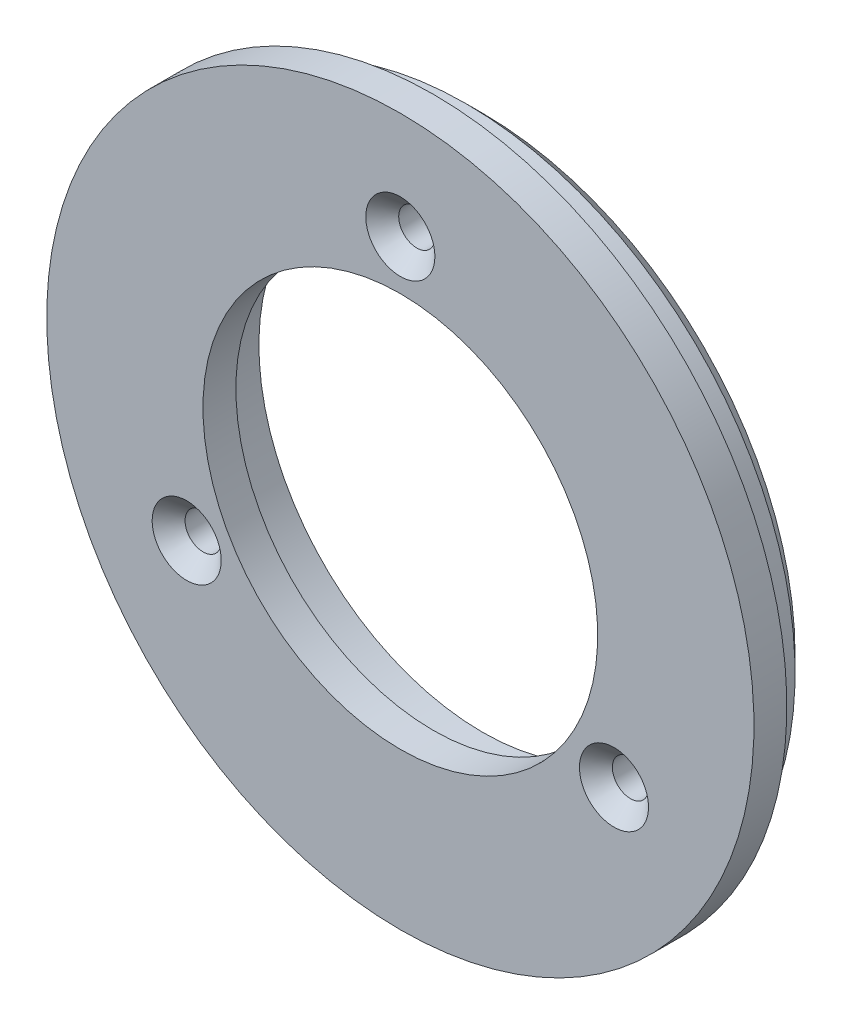
ISO-10303-21;
HEADER;
FILE_DESCRIPTION(('STEP AP214'),'2;1');
FILE_NAME('part.step','',(''),(''),'','','');
FILE_SCHEMA(('AUTOMOTIVE_DESIGN { 1 0 10303 214 1 1 1 1 }'));
ENDSEC;
DATA;
#1=APPLICATION_CONTEXT('core data for automotive mechanical design processes');
#2=APPLICATION_PROTOCOL_DEFINITION('international standard','automotive_design',2000,#1);
#3=PRODUCT_CONTEXT('',#1,'mechanical');
#4=PRODUCT('Part','Part','',(#3));
#5=PRODUCT_RELATED_PRODUCT_CATEGORY('part','',(#4));
#6=PRODUCT_DEFINITION_FORMATION('','',#4);
#7=PRODUCT_DEFINITION_CONTEXT('part definition',#1,'design');
#8=PRODUCT_DEFINITION('design','',#6,#7);
#9=PRODUCT_DEFINITION_SHAPE('','',#8);
#10=(LENGTH_UNIT() NAMED_UNIT(*) SI_UNIT(.MILLI.,.METRE.));
#11=(NAMED_UNIT(*) PLANE_ANGLE_UNIT() SI_UNIT($,.RADIAN.));
#12=(NAMED_UNIT(*) SI_UNIT($,.STERADIAN.) SOLID_ANGLE_UNIT());
#13=UNCERTAINTY_MEASURE_WITH_UNIT(LENGTH_MEASURE(1.E-05),#10,'distance_accuracy_value','');
#14=(GEOMETRIC_REPRESENTATION_CONTEXT(3) GLOBAL_UNCERTAINTY_ASSIGNED_CONTEXT((#13)) GLOBAL_UNIT_ASSIGNED_CONTEXT((#10,
#11,#12)) REPRESENTATION_CONTEXT('',''));
#15=CARTESIAN_POINT('',(0.,0.,0.));
#16=DIRECTION('',(0.,0.,1.));
#17=DIRECTION('',(1.,0.,0.));
#18=AXIS2_PLACEMENT_3D('',#15,#16,#17);
#19=CARTESIAN_POINT('',(0.,12.,0.));
#20=DIRECTION('',(0.,0.,-1.));
#21=DIRECTION('',(0.,1.,0.));
#22=AXIS2_PLACEMENT_3D('',#19,#20,#21);
#23=PLANE('',#22);
#24=CARTESIAN_POINT('',(-12.9903810567672,-7.49999999999963,0.));
#25=DIRECTION('',(0.,0.,-1.));
#26=DIRECTION('',(0.,1.,0.));
#27=AXIS2_PLACEMENT_3D('',#24,#25,#26);
#28=CIRCLE('',#27,2.10000000000057);
#29=CARTESIAN_POINT('',(-12.9903810567672,-5.39999999999906,0.));
#30=VERTEX_POINT('',#29);
#31=EDGE_CURVE('E64',#30,#30,#28,.T.);
#32=ORIENTED_EDGE('',*,*,#31,.T.);
#33=EDGE_LOOP('',(#32));
#34=FACE_BOUND('',#33,.T.);
#35=CARTESIAN_POINT('',(12.9903810567659,-7.50000000000036,0.));
#36=DIRECTION('',(0.,0.,-1.));
#37=DIRECTION('',(0.,1.,0.));
#38=AXIS2_PLACEMENT_3D('',#35,#36,#37);
#39=CIRCLE('',#38,2.10000000000084);
#40=CARTESIAN_POINT('',(12.9903810567659,-5.39999999999953,0.));
#41=VERTEX_POINT('',#40);
#42=EDGE_CURVE('E70',#41,#41,#39,.T.);
#43=ORIENTED_EDGE('',*,*,#42,.T.);
#44=EDGE_LOOP('',(#43));
#45=FACE_BOUND('',#44,.T.);
#46=CARTESIAN_POINT('',(0.,15.,0.));
#47=DIRECTION('',(0.,0.,-1.));
#48=DIRECTION('',(0.,1.,0.));
#49=AXIS2_PLACEMENT_3D('',#46,#47,#48);
#50=CIRCLE('',#49,2.1);
#51=CARTESIAN_POINT('',(0.,17.1,0.));
#52=VERTEX_POINT('',#51);
#53=EDGE_CURVE('E74',#52,#52,#50,.T.);
#54=ORIENTED_EDGE('',*,*,#53,.T.);
#55=EDGE_LOOP('',(#54));
#56=FACE_BOUND('',#55,.T.);
#57=CARTESIAN_POINT('',(0.,0.,0.));
#58=DIRECTION('',(0.,0.,1.));
#59=DIRECTION('',(0.,-1.,0.));
#60=AXIS2_PLACEMENT_3D('',#57,#58,#59);
#61=CIRCLE('',#60,12.);
#62=CARTESIAN_POINT('',(0.,-12.,0.));
#63=VERTEX_POINT('',#62);
#64=EDGE_CURVE('E110',#63,#63,#61,.T.);
#65=ORIENTED_EDGE('',*,*,#64,.F.);
#66=EDGE_LOOP('',(#65));
#67=FACE_BOUND('',#66,.T.);
#68=CARTESIAN_POINT('',(0.,0.,0.));
#69=DIRECTION('',(0.,0.,1.));
#70=DIRECTION('',(0.,-1.,0.));
#71=AXIS2_PLACEMENT_3D('',#68,#69,#70);
#72=CIRCLE('',#71,21.5);
#73=CARTESIAN_POINT('',(0.,-21.5,0.));
#74=VERTEX_POINT('',#73);
#75=EDGE_CURVE('E86',#74,#74,#72,.T.);
#76=ORIENTED_EDGE('',*,*,#75,.T.);
#77=EDGE_LOOP('',(#76));
#78=FACE_BOUND('',#77,.T.);
#79=ADVANCED_FACE('F45',(#34,#45,#56,#67,#78),#23,.F.);
#80=CARTESIAN_POINT('',(0.,0.,0.));
#81=DIRECTION('',(0.,0.,1.));
#82=DIRECTION('',(0.,-1.,0.));
#83=AXIS2_PLACEMENT_3D('',#80,#81,#82);
#84=CYLINDRICAL_SURFACE('',#83,21.5);
#85=ORIENTED_EDGE('',*,*,#75,.F.);
#86=EDGE_LOOP('',(#85));
#87=FACE_BOUND('',#86,.T.);
#88=CARTESIAN_POINT('',(0.,0.,-2.));
#89=DIRECTION('',(0.,0.,1.));
#90=DIRECTION('',(0.,-1.,0.));
#91=AXIS2_PLACEMENT_3D('',#88,#89,#90);
#92=CIRCLE('',#91,21.5);
#93=CARTESIAN_POINT('',(0.,-21.5,-2.));
#94=VERTEX_POINT('',#93);
#95=EDGE_CURVE('E90',#94,#94,#92,.T.);
#96=ORIENTED_EDGE('',*,*,#95,.T.);
#97=EDGE_LOOP('',(#96));
#98=FACE_BOUND('',#97,.T.);
#99=ADVANCED_FACE('F163',(#87,#98),#84,.T.);
#100=CARTESIAN_POINT('',(0.,21.5,-2.));
#101=DIRECTION('',(0.,0.,1.));
#102=DIRECTION('',(0.,-1.,0.));
#103=AXIS2_PLACEMENT_3D('',#100,#101,#102);
#104=PLANE('',#103);
#105=ORIENTED_EDGE('',*,*,#95,.F.);
#106=EDGE_LOOP('',(#105));
#107=FACE_BOUND('',#106,.T.);
#108=CARTESIAN_POINT('',(0.,0.,-2.));
#109=DIRECTION('',(0.,0.,1.));
#110=DIRECTION('',(0.,-1.,0.));
#111=AXIS2_PLACEMENT_3D('',#108,#109,#110);
#112=CIRCLE('',#111,20.);
#113=CARTESIAN_POINT('',(0.,-20.,-2.));
#114=VERTEX_POINT('',#113);
#115=EDGE_CURVE('E94',#114,#114,#112,.T.);
#116=ORIENTED_EDGE('',*,*,#115,.T.);
#117=EDGE_LOOP('',(#116));
#118=FACE_BOUND('',#117,.T.);
#119=ADVANCED_FACE('F170',(#107,#118),#104,.F.);
#120=CARTESIAN_POINT('',(0.,0.,0.));
#121=DIRECTION('',(0.,0.,1.));
#122=DIRECTION('',(0.,-1.,0.));
#123=AXIS2_PLACEMENT_3D('',#120,#121,#122);
#124=CYLINDRICAL_SURFACE('',#123,20.);
#125=CARTESIAN_POINT('',(0.,0.,-3.99999999999999));
#126=DIRECTION('',(0.,0.,1.));
#127=DIRECTION('',(0.,-1.,0.));
#128=AXIS2_PLACEMENT_3D('',#125,#126,#127);
#129=CIRCLE('',#128,20.);
#130=CARTESIAN_POINT('',(0.,-20.,-3.99999999999999));
#131=VERTEX_POINT('',#130);
#132=EDGE_CURVE('E82',#131,#131,#129,.T.);
#133=ORIENTED_EDGE('',*,*,#132,.T.);
#134=EDGE_LOOP('',(#133));
#135=FACE_BOUND('',#134,.T.);
#136=ORIENTED_EDGE('',*,*,#115,.F.);
#137=EDGE_LOOP('',(#136));
#138=FACE_BOUND('',#137,.T.);
#139=ADVANCED_FACE('F133',(#135,#138),#124,.T.);
#140=CARTESIAN_POINT('',(0.,20.,-5.));
#141=DIRECTION('',(0.,0.,1.));
#142=DIRECTION('',(0.,-1.,0.));
#143=AXIS2_PLACEMENT_3D('',#140,#141,#142);
#144=PLANE('',#143);
#145=CARTESIAN_POINT('',(-12.9903810567672,-7.49999999999963,-5.));
#146=DIRECTION('',(0.,0.,-1.));
#147=DIRECTION('',(-1.,0.,0.));
#148=AXIS2_PLACEMENT_3D('',#145,#146,#147);
#149=CIRCLE('',#148,1.10000000000057);
#150=CARTESIAN_POINT('',(-14.0903810567678,-7.49999999999963,-5.));
#151=VERTEX_POINT('',#150);
#152=EDGE_CURVE('E114',#151,#151,#149,.T.);
#153=ORIENTED_EDGE('',*,*,#152,.F.);
#154=EDGE_LOOP('',(#153));
#155=FACE_BOUND('',#154,.T.);
#156=CARTESIAN_POINT('',(12.9903810567659,-7.50000000000036,-5.));
#157=DIRECTION('',(0.,0.,-1.));
#158=DIRECTION('',(-1.,0.,0.));
#159=AXIS2_PLACEMENT_3D('',#156,#157,#158);
#160=CIRCLE('',#159,1.10000000000084);
#161=CARTESIAN_POINT('',(11.8903810567651,-7.50000000000036,-5.));
#162=VERTEX_POINT('',#161);
#163=EDGE_CURVE('E119',#162,#162,#160,.T.);
#164=ORIENTED_EDGE('',*,*,#163,.F.);
#165=EDGE_LOOP('',(#164));
#166=FACE_BOUND('',#165,.T.);
#167=CARTESIAN_POINT('',(0.,15.,-5.));
#168=DIRECTION('',(0.,0.,-1.));
#169=DIRECTION('',(0.,1.,0.));
#170=AXIS2_PLACEMENT_3D('',#167,#168,#169);
#171=CIRCLE('',#170,1.1);
#172=CARTESIAN_POINT('',(0.,16.1,-5.));
#173=VERTEX_POINT('',#172);
#174=EDGE_CURVE('E115',#173,#173,#171,.T.);
#175=ORIENTED_EDGE('',*,*,#174,.F.);
#176=EDGE_LOOP('',(#175));
#177=FACE_BOUND('',#176,.T.);
#178=CARTESIAN_POINT('',(0.,0.,-5.));
#179=DIRECTION('',(0.,0.,1.));
#180=DIRECTION('',(0.,-1.,0.));
#181=AXIS2_PLACEMENT_3D('',#178,#179,#180);
#182=CIRCLE('',#181,19.);
#183=CARTESIAN_POINT('',(0.,-19.,-5.));
#184=VERTEX_POINT('',#183);
#185=EDGE_CURVE('E78',#184,#184,#182,.F.);
#186=ORIENTED_EDGE('',*,*,#185,.T.);
#187=EDGE_LOOP('',(#186));
#188=FACE_BOUND('',#187,.T.);
#189=CARTESIAN_POINT('',(0.,0.,-5.));
#190=DIRECTION('',(0.,0.,1.));
#191=DIRECTION('',(0.,-1.,0.));
#192=AXIS2_PLACEMENT_3D('',#189,#190,#191);
#193=CIRCLE('',#192,13.6);
#194=CARTESIAN_POINT('',(0.,-13.6,-5.));
#195=VERTEX_POINT('',#194);
#196=EDGE_CURVE('E98',#195,#195,#193,.T.);
#197=ORIENTED_EDGE('',*,*,#196,.T.);
#198=EDGE_LOOP('',(#197));
#199=FACE_BOUND('',#198,.T.);
#200=ADVANCED_FACE('F129',(#155,#166,#177,#188,#199),#144,.F.);
#201=CARTESIAN_POINT('',(0.,0.,0.));
#202=DIRECTION('',(0.,0.,1.));
#203=DIRECTION('',(0.,-1.,0.));
#204=AXIS2_PLACEMENT_3D('',#201,#202,#203);
#205=CYLINDRICAL_SURFACE('',#204,13.6);
#206=ORIENTED_EDGE('',*,*,#196,.F.);
#207=EDGE_LOOP('',(#206));
#208=FACE_BOUND('',#207,.T.);
#209=CARTESIAN_POINT('',(0.,0.,-2.));
#210=DIRECTION('',(0.,0.,1.));
#211=DIRECTION('',(0.,-1.,0.));
#212=AXIS2_PLACEMENT_3D('',#209,#210,#211);
#213=CIRCLE('',#212,13.6);
#214=CARTESIAN_POINT('',(0.,-13.6,-2.));
#215=VERTEX_POINT('',#214);
#216=EDGE_CURVE('E102',#215,#215,#213,.T.);
#217=ORIENTED_EDGE('',*,*,#216,.T.);
#218=EDGE_LOOP('',(#217));
#219=FACE_BOUND('',#218,.T.);
#220=ADVANCED_FACE('F132',(#208,#219),#205,.F.);
#221=CARTESIAN_POINT('',(0.,12.,-2.));
#222=DIRECTION('',(0.,0.,1.));
#223=DIRECTION('',(0.,-1.,0.));
#224=AXIS2_PLACEMENT_3D('',#221,#222,#223);
#225=PLANE('',#224);
#226=ORIENTED_EDGE('',*,*,#216,.F.);
#227=EDGE_LOOP('',(#226));
#228=FACE_BOUND('',#227,.T.);
#229=CARTESIAN_POINT('',(0.,0.,-2.));
#230=DIRECTION('',(0.,0.,1.));
#231=DIRECTION('',(0.,-1.,0.));
#232=AXIS2_PLACEMENT_3D('',#229,#230,#231);
#233=CIRCLE('',#232,12.);
#234=CARTESIAN_POINT('',(0.,-12.,-2.));
#235=VERTEX_POINT('',#234);
#236=EDGE_CURVE('E106',#235,#235,#233,.T.);
#237=ORIENTED_EDGE('',*,*,#236,.T.);
#238=EDGE_LOOP('',(#237));
#239=FACE_BOUND('',#238,.T.);
#240=ADVANCED_FACE('F145',(#228,#239),#225,.F.);
#241=CARTESIAN_POINT('',(0.,0.,0.));
#242=DIRECTION('',(0.,0.,1.));
#243=DIRECTION('',(0.,-1.,0.));
#244=AXIS2_PLACEMENT_3D('',#241,#242,#243);
#245=CYLINDRICAL_SURFACE('',#244,12.);
#246=ORIENTED_EDGE('',*,*,#236,.F.);
#247=EDGE_LOOP('',(#246));
#248=FACE_BOUND('',#247,.T.);
#249=ORIENTED_EDGE('',*,*,#64,.T.);
#250=EDGE_LOOP('',(#249));
#251=FACE_BOUND('',#250,.T.);
#252=ADVANCED_FACE('F151',(#248,#251),#245,.F.);
#253=CARTESIAN_POINT('',(0.,0.,-3.99999999999999));
#254=DIRECTION('',(0.,0.,1.));
#255=DIRECTION('',(0.,-1.,0.));
#256=AXIS2_PLACEMENT_3D('',#253,#254,#255);
#257=CONICAL_SURFACE('',#256,20.,0.785398163397448);
#258=ORIENTED_EDGE('',*,*,#185,.F.);
#259=EDGE_LOOP('',(#258));
#260=FACE_BOUND('',#259,.T.);
#261=ORIENTED_EDGE('',*,*,#132,.F.);
#262=EDGE_LOOP('',(#261));
#263=FACE_BOUND('',#262,.T.);
#264=ADVANCED_FACE('F157',(#260,#263),#257,.T.);
#265=CARTESIAN_POINT('',(0.,15.,0.));
#266=DIRECTION('',(0.,0.,-1.));
#267=DIRECTION('',(0.,1.,0.));
#268=AXIS2_PLACEMENT_3D('',#265,#266,#267);
#269=CYLINDRICAL_SURFACE('',#268,1.1);
#270=CARTESIAN_POINT('',(0.,15.,-1.00000000000001));
#271=DIRECTION('',(0.,0.,-1.));
#272=DIRECTION('',(-1.,0.,0.));
#273=AXIS2_PLACEMENT_3D('',#270,#271,#272);
#274=CIRCLE('',#273,1.1);
#275=CARTESIAN_POINT('',(-1.1,15.,-1.00000000000001));
#276=VERTEX_POINT('',#275);
#277=EDGE_CURVE('E10',#276,#276,#274,.F.);
#278=ORIENTED_EDGE('',*,*,#277,.T.);
#279=EDGE_LOOP('',(#278));
#280=FACE_BOUND('',#279,.T.);
#281=ORIENTED_EDGE('',*,*,#174,.T.);
#282=EDGE_LOOP('',(#281));
#283=FACE_BOUND('',#282,.T.);
#284=ADVANCED_FACE('F191',(#280,#283),#269,.F.);
#285=CARTESIAN_POINT('',(12.9903810567659,-7.50000000000036,0.));
#286=DIRECTION('',(0.,0.,-1.));
#287=DIRECTION('',(0.,1.,0.));
#288=AXIS2_PLACEMENT_3D('',#285,#286,#287);
#289=CYLINDRICAL_SURFACE('',#288,1.10000000000084);
#290=CARTESIAN_POINT('',(12.9903810567659,-7.50000000000036,-0.999999999999997));
#291=DIRECTION('',(0.,0.,-1.));
#292=DIRECTION('',(-1.,0.,0.));
#293=AXIS2_PLACEMENT_3D('',#290,#291,#292);
#294=CIRCLE('',#293,1.10000000000084);
#295=CARTESIAN_POINT('',(11.8903810567651,-7.50000000000036,-0.999999999999997));
#296=VERTEX_POINT('',#295);
#297=EDGE_CURVE('E54',#296,#296,#294,.F.);
#298=ORIENTED_EDGE('',*,*,#297,.T.);
#299=EDGE_LOOP('',(#298));
#300=FACE_BOUND('',#299,.T.);
#301=ORIENTED_EDGE('',*,*,#163,.T.);
#302=EDGE_LOOP('',(#301));
#303=FACE_BOUND('',#302,.T.);
#304=ADVANCED_FACE('F236',(#300,#303),#289,.F.);
#305=CARTESIAN_POINT('',(-12.9903810567672,-7.49999999999963,0.));
#306=DIRECTION('',(0.,0.,-1.));
#307=DIRECTION('',(0.,1.,0.));
#308=AXIS2_PLACEMENT_3D('',#305,#306,#307);
#309=CYLINDRICAL_SURFACE('',#308,1.10000000000057);
#310=CARTESIAN_POINT('',(-12.9903810567672,-7.49999999999963,-1.00000000000001));
#311=DIRECTION('',(0.,0.,-1.));
#312=DIRECTION('',(-1.,0.,0.));
#313=AXIS2_PLACEMENT_3D('',#310,#311,#312);
#314=CIRCLE('',#313,1.10000000000057);
#315=CARTESIAN_POINT('',(-14.0903810567678,-7.49999999999963,-1.00000000000001));
#316=VERTEX_POINT('',#315);
#317=EDGE_CURVE('E59',#316,#316,#314,.F.);
#318=ORIENTED_EDGE('',*,*,#317,.T.);
#319=EDGE_LOOP('',(#318));
#320=FACE_BOUND('',#319,.T.);
#321=ORIENTED_EDGE('',*,*,#152,.T.);
#322=EDGE_LOOP('',(#321));
#323=FACE_BOUND('',#322,.T.);
#324=ADVANCED_FACE('F127',(#320,#323),#309,.F.);
#325=CARTESIAN_POINT('',(-12.9903810567672,-7.49999999999963,0.));
#326=DIRECTION('',(0.,0.,1.));
#327=DIRECTION('',(1.,0.,0.));
#328=AXIS2_PLACEMENT_3D('',#325,#326,#327);
#329=CONICAL_SURFACE('',#328,2.10000000000057,0.785398163397447);
#330=ORIENTED_EDGE('',*,*,#317,.F.);
#331=EDGE_LOOP('',(#330));
#332=FACE_BOUND('',#331,.T.);
#333=ORIENTED_EDGE('',*,*,#31,.F.);
#334=EDGE_LOOP('',(#333));
#335=FACE_BOUND('',#334,.T.);
#336=ADVANCED_FACE('F193',(#332,#335),#329,.F.);
#337=CARTESIAN_POINT('',(12.9903810567659,-7.50000000000036,0.));
#338=DIRECTION('',(0.,0.,1.));
#339=DIRECTION('',(1.,0.,0.));
#340=AXIS2_PLACEMENT_3D('',#337,#338,#339);
#341=CONICAL_SURFACE('',#340,2.10000000000084,0.785398163397447);
#342=ORIENTED_EDGE('',*,*,#297,.F.);
#343=EDGE_LOOP('',(#342));
#344=FACE_BOUND('',#343,.T.);
#345=ORIENTED_EDGE('',*,*,#42,.F.);
#346=EDGE_LOOP('',(#345));
#347=FACE_BOUND('',#346,.T.);
#348=ADVANCED_FACE('F198',(#344,#347),#341,.F.);
#349=CARTESIAN_POINT('',(0.,15.,0.));
#350=DIRECTION('',(0.,0.,1.));
#351=DIRECTION('',(1.,0.,0.));
#352=AXIS2_PLACEMENT_3D('',#349,#350,#351);
#353=CONICAL_SURFACE('',#352,2.1,0.785398163397447);
#354=ORIENTED_EDGE('',*,*,#277,.F.);
#355=EDGE_LOOP('',(#354));
#356=FACE_BOUND('',#355,.T.);
#357=ORIENTED_EDGE('',*,*,#53,.F.);
#358=EDGE_LOOP('',(#357));
#359=FACE_BOUND('',#358,.T.);
#360=ADVANCED_FACE('F48',(#356,#359),#353,.F.);
#361=CLOSED_SHELL('',(#79,#99,#119,#139,#200,#220,#240,#252,#264,#284,#304,#324,#336,#348,#360));
#362=MANIFOLD_SOLID_BREP('B2',#361);
#363=ADVANCED_BREP_SHAPE_REPRESENTATION('',(#18,#362),#14);
#364=SHAPE_DEFINITION_REPRESENTATION(#9,#363);
ENDSEC;
END-ISO-10303-21;
